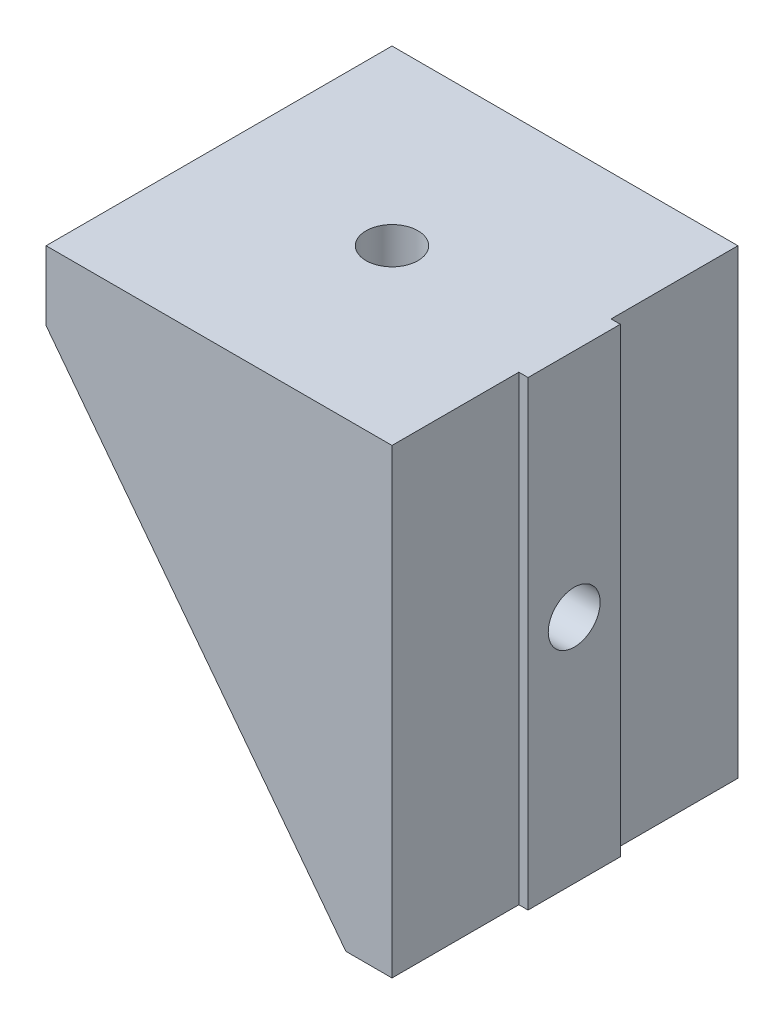
ISO-10303-21;
HEADER;
FILE_DESCRIPTION(('STEP AP214'),'2;1');
FILE_NAME('part.step','',(''),(''),'','','');
FILE_SCHEMA(('AUTOMOTIVE_DESIGN { 1 0 10303 214 1 1 1 1 }'));
ENDSEC;
DATA;
#1=APPLICATION_CONTEXT('core data for automotive mechanical design processes');
#2=APPLICATION_PROTOCOL_DEFINITION('international standard','automotive_design',2000,#1);
#3=PRODUCT_CONTEXT('',#1,'mechanical');
#4=PRODUCT('Part','Part','',(#3));
#5=PRODUCT_RELATED_PRODUCT_CATEGORY('part','',(#4));
#6=PRODUCT_DEFINITION_FORMATION('','',#4);
#7=PRODUCT_DEFINITION_CONTEXT('part definition',#1,'design');
#8=PRODUCT_DEFINITION('design','',#6,#7);
#9=PRODUCT_DEFINITION_SHAPE('','',#8);
#10=(LENGTH_UNIT() NAMED_UNIT(*) SI_UNIT(.MILLI.,.METRE.));
#11=(NAMED_UNIT(*) PLANE_ANGLE_UNIT() SI_UNIT($,.RADIAN.));
#12=(NAMED_UNIT(*) SI_UNIT($,.STERADIAN.) SOLID_ANGLE_UNIT());
#13=UNCERTAINTY_MEASURE_WITH_UNIT(LENGTH_MEASURE(1.E-05),#10,'distance_accuracy_value','');
#14=(GEOMETRIC_REPRESENTATION_CONTEXT(3) GLOBAL_UNCERTAINTY_ASSIGNED_CONTEXT((#13)) GLOBAL_UNIT_ASSIGNED_CONTEXT((#10,
#11,#12)) REPRESENTATION_CONTEXT('',''));
#15=CARTESIAN_POINT('',(0.,0.,0.));
#16=DIRECTION('',(0.,0.,1.));
#17=DIRECTION('',(1.,0.,0.));
#18=AXIS2_PLACEMENT_3D('',#15,#16,#17);
#19=CARTESIAN_POINT('',(-30.,-6.,15.));
#20=DIRECTION('',(0.794357832977196,0.607450107570797,0.));
#21=DIRECTION('',(-0.607450107570797,0.794357832977196,0.));
#22=AXIS2_PLACEMENT_3D('',#19,#20,#21);
#23=PLANE('',#22);
#24=DIRECTION('',(0.607450107570797,-0.794357832977196,0.));
#25=VECTOR('',#24,1.);
#26=CARTESIAN_POINT('',(-30.,-6.,-10.));
#27=LINE('',#26,#25);
#28=CARTESIAN_POINT('',(-30.,-6.,-10.));
#29=VERTEX_POINT('',#28);
#30=CARTESIAN_POINT('',(-4.,-40.,-10.));
#31=VERTEX_POINT('',#30);
#32=EDGE_CURVE('E11',#29,#31,#27,.T.);
#33=ORIENTED_EDGE('',*,*,#32,.F.);
#34=DIRECTION('',(0.,0.,-1.));
#35=VECTOR('',#34,1.);
#36=CARTESIAN_POINT('',(-30.,-6.,15.));
#37=LINE('',#36,#35);
#38=CARTESIAN_POINT('',(-30.,-6.,-15.));
#39=VERTEX_POINT('',#38);
#40=EDGE_CURVE('E208',#29,#39,#37,.T.);
#41=ORIENTED_EDGE('',*,*,#40,.T.);
#42=DIRECTION('',(0.607450107570797,-0.794357832977196,0.));
#43=VECTOR('',#42,1.);
#44=CARTESIAN_POINT('',(-30.,-6.,-15.));
#45=LINE('',#44,#43);
#46=CARTESIAN_POINT('',(-4.,-40.,-15.));
#47=VERTEX_POINT('',#46);
#48=EDGE_CURVE('E230',#39,#47,#45,.T.);
#49=ORIENTED_EDGE('',*,*,#48,.T.);
#50=DIRECTION('',(0.,0.,-1.));
#51=VECTOR('',#50,1.);
#52=CARTESIAN_POINT('',(-4.,-40.,15.));
#53=LINE('',#52,#51);
#54=EDGE_CURVE('E197',#31,#47,#53,.T.);
#55=ORIENTED_EDGE('',*,*,#54,.F.);
#56=EDGE_LOOP('',(#33,#41,#49,#55));
#57=FACE_BOUND('',#56,.T.);
#58=ADVANCED_FACE('F34',(#57),#23,.F.);
#59=CARTESIAN_POINT('',(0.,-40.,15.));
#60=DIRECTION('',(-1.,0.,0.));
#61=DIRECTION('',(0.,0.,1.));
#62=AXIS2_PLACEMENT_3D('',#59,#60,#61);
#63=PLANE('',#62);
#64=DIRECTION('',(0.,-1.,0.));
#65=VECTOR('',#64,1.);
#66=CARTESIAN_POINT('',(0.,0.,4.));
#67=LINE('',#66,#65);
#68=CARTESIAN_POINT('',(0.,0.,4.));
#69=VERTEX_POINT('',#68);
#70=CARTESIAN_POINT('',(0.,-40.,4.));
#71=VERTEX_POINT('',#70);
#72=EDGE_CURVE('E149',#69,#71,#67,.T.);
#73=ORIENTED_EDGE('',*,*,#72,.F.);
#74=DIRECTION('',(0.,0.,-1.));
#75=VECTOR('',#74,1.);
#76=CARTESIAN_POINT('',(0.,0.,15.));
#77=LINE('',#76,#75);
#78=CARTESIAN_POINT('',(0.,0.,15.));
#79=VERTEX_POINT('',#78);
#80=EDGE_CURVE('E177',#79,#69,#77,.T.);
#81=ORIENTED_EDGE('',*,*,#80,.F.);
#82=DIRECTION('',(0.,1.,0.));
#83=VECTOR('',#82,1.);
#84=CARTESIAN_POINT('',(0.,-40.,15.));
#85=LINE('',#84,#83);
#86=CARTESIAN_POINT('',(0.,-40.,15.));
#87=VERTEX_POINT('',#86);
#88=EDGE_CURVE('E243',#87,#79,#85,.T.);
#89=ORIENTED_EDGE('',*,*,#88,.F.);
#90=DIRECTION('',(0.,0.,-1.));
#91=VECTOR('',#90,1.);
#92=CARTESIAN_POINT('',(0.,-40.,15.));
#93=LINE('',#92,#91);
#94=EDGE_CURVE('E194',#87,#71,#93,.T.);
#95=ORIENTED_EDGE('',*,*,#94,.T.);
#96=EDGE_LOOP('',(#73,#81,#89,#95));
#97=FACE_BOUND('',#96,.T.);
#98=ADVANCED_FACE('F36',(#97),#63,.F.);
#99=DIRECTION('',(0.,1.,0.));
#100=VECTOR('',#99,1.);
#101=CARTESIAN_POINT('',(0.,0.,-4.));
#102=LINE('',#101,#100);
#103=CARTESIAN_POINT('',(0.,-40.,-4.));
#104=VERTEX_POINT('',#103);
#105=CARTESIAN_POINT('',(0.,0.,-4.));
#106=VERTEX_POINT('',#105);
#107=EDGE_CURVE('E57',#104,#106,#102,.T.);
#108=ORIENTED_EDGE('',*,*,#107,.F.);
#109=CARTESIAN_POINT('',(0.,-40.,-15.));
#110=VERTEX_POINT('',#109);
#111=EDGE_CURVE('E198',#104,#110,#93,.T.);
#112=ORIENTED_EDGE('',*,*,#111,.T.);
#113=DIRECTION('',(0.,1.,0.));
#114=VECTOR('',#113,1.);
#115=CARTESIAN_POINT('',(0.,-40.,-15.));
#116=LINE('',#115,#114);
#117=CARTESIAN_POINT('',(0.,0.,-15.));
#118=VERTEX_POINT('',#117);
#119=EDGE_CURVE('E232',#110,#118,#116,.T.);
#120=ORIENTED_EDGE('',*,*,#119,.T.);
#121=EDGE_CURVE('E183',#106,#118,#77,.T.);
#122=ORIENTED_EDGE('',*,*,#121,.F.);
#123=EDGE_LOOP('',(#108,#112,#120,#122));
#124=FACE_BOUND('',#123,.T.);
#125=ADVANCED_FACE('F253',(#124),#63,.F.);
#126=CARTESIAN_POINT('',(0.,0.,15.));
#127=DIRECTION('',(0.,-1.,0.));
#128=DIRECTION('',(0.,0.,-1.));
#129=AXIS2_PLACEMENT_3D('',#126,#127,#128);
#130=PLANE('',#129);
#131=CARTESIAN_POINT('',(-15.,0.,0.));
#132=DIRECTION('',(0.,1.,0.));
#133=DIRECTION('',(0.,0.,1.));
#134=AXIS2_PLACEMENT_3D('',#131,#132,#133);
#135=CIRCLE('',#134,2.25);
#136=CARTESIAN_POINT('',(-15.,0.,2.25));
#137=VERTEX_POINT('',#136);
#138=EDGE_CURVE('E390',#137,#137,#135,.T.);
#139=ORIENTED_EDGE('',*,*,#138,.F.);
#140=EDGE_LOOP('',(#139));
#141=FACE_BOUND('',#140,.T.);
#142=DIRECTION('',(-1.,0.,0.));
#143=VECTOR('',#142,1.);
#144=CARTESIAN_POINT('',(0.,0.,-15.));
#145=LINE('',#144,#143);
#146=CARTESIAN_POINT('',(-30.,0.,-15.));
#147=VERTEX_POINT('',#146);
#148=EDGE_CURVE('E226',#118,#147,#145,.T.);
#149=ORIENTED_EDGE('',*,*,#148,.T.);
#150=DIRECTION('',(0.,0.,-1.));
#151=VECTOR('',#150,1.);
#152=CARTESIAN_POINT('',(-30.,0.,15.));
#153=LINE('',#152,#151);
#154=CARTESIAN_POINT('',(-30.,0.,15.));
#155=VERTEX_POINT('',#154);
#156=EDGE_CURVE('E188',#155,#147,#153,.T.);
#157=ORIENTED_EDGE('',*,*,#156,.F.);
#158=DIRECTION('',(-1.,0.,0.));
#159=VECTOR('',#158,1.);
#160=CARTESIAN_POINT('',(0.,0.,15.));
#161=LINE('',#160,#159);
#162=EDGE_CURVE('E242',#79,#155,#161,.T.);
#163=ORIENTED_EDGE('',*,*,#162,.F.);
#164=ORIENTED_EDGE('',*,*,#80,.T.);
#165=DIRECTION('',(-1.,0.,0.));
#166=VECTOR('',#165,1.);
#167=CARTESIAN_POINT('',(0.8,0.,4.));
#168=LINE('',#167,#166);
#169=CARTESIAN_POINT('',(0.8,0.,4.));
#170=VERTEX_POINT('',#169);
#171=EDGE_CURVE('E160',#170,#69,#168,.T.);
#172=ORIENTED_EDGE('',*,*,#171,.F.);
#173=DIRECTION('',(0.,0.,1.));
#174=VECTOR('',#173,1.);
#175=CARTESIAN_POINT('',(0.8,0.,4.));
#176=LINE('',#175,#174);
#177=CARTESIAN_POINT('',(0.8,0.,-4.));
#178=VERTEX_POINT('',#177);
#179=EDGE_CURVE('E158',#178,#170,#176,.T.);
#180=ORIENTED_EDGE('',*,*,#179,.F.);
#181=DIRECTION('',(-1.,0.,0.));
#182=VECTOR('',#181,1.);
#183=CARTESIAN_POINT('',(0.8,0.,-4.));
#184=LINE('',#183,#182);
#185=EDGE_CURVE('E173',#178,#106,#184,.T.);
#186=ORIENTED_EDGE('',*,*,#185,.T.);
#187=ORIENTED_EDGE('',*,*,#121,.T.);
#188=EDGE_LOOP('',(#149,#157,#163,#164,#172,#180,#186,#187));
#189=FACE_BOUND('',#188,.T.);
#190=ADVANCED_FACE('F261',(#141,#189),#130,.F.);
#191=CARTESIAN_POINT('',(-30.,0.,15.));
#192=DIRECTION('',(1.,0.,0.));
#193=DIRECTION('',(0.,0.,-1.));
#194=AXIS2_PLACEMENT_3D('',#191,#192,#193);
#195=PLANE('',#194);
#196=DIRECTION('',(0.,-1.,0.));
#197=VECTOR('',#196,1.);
#198=CARTESIAN_POINT('',(-30.,0.,-15.));
#199=LINE('',#198,#197);
#200=EDGE_CURVE('E218',#147,#39,#199,.T.);
#201=ORIENTED_EDGE('',*,*,#200,.T.);
#202=ORIENTED_EDGE('',*,*,#40,.F.);
#203=DIRECTION('',(0.,0.,1.));
#204=VECTOR('',#203,1.);
#205=CARTESIAN_POINT('',(-30.,-6.,-10.));
#206=LINE('',#205,#204);
#207=CARTESIAN_POINT('',(-30.,-6.,10.));
#208=VERTEX_POINT('',#207);
#209=EDGE_CURVE('E129',#29,#208,#206,.T.);
#210=ORIENTED_EDGE('',*,*,#209,.T.);
#211=CARTESIAN_POINT('',(-30.,-6.,15.));
#212=VERTEX_POINT('',#211);
#213=EDGE_CURVE('E209',#212,#208,#37,.T.);
#214=ORIENTED_EDGE('',*,*,#213,.F.);
#215=DIRECTION('',(0.,-1.,0.));
#216=VECTOR('',#215,1.);
#217=CARTESIAN_POINT('',(-30.,0.,15.));
#218=LINE('',#217,#216);
#219=EDGE_CURVE('E221',#155,#212,#218,.T.);
#220=ORIENTED_EDGE('',*,*,#219,.F.);
#221=ORIENTED_EDGE('',*,*,#156,.T.);
#222=EDGE_LOOP('',(#201,#202,#210,#214,#220,#221));
#223=FACE_BOUND('',#222,.T.);
#224=ADVANCED_FACE('F216',(#223),#195,.F.);
#225=ORIENTED_EDGE('',*,*,#213,.T.);
#226=DIRECTION('',(0.607450107570797,-0.794357832977196,0.));
#227=VECTOR('',#226,1.);
#228=CARTESIAN_POINT('',(-30.,-6.,10.));
#229=LINE('',#228,#227);
#230=CARTESIAN_POINT('',(-4.,-40.,10.));
#231=VERTEX_POINT('',#230);
#232=EDGE_CURVE('E43',#208,#231,#229,.T.);
#233=ORIENTED_EDGE('',*,*,#232,.T.);
#234=CARTESIAN_POINT('',(-4.,-40.,15.));
#235=VERTEX_POINT('',#234);
#236=EDGE_CURVE('E205',#235,#231,#53,.T.);
#237=ORIENTED_EDGE('',*,*,#236,.F.);
#238=DIRECTION('',(0.607450107570797,-0.794357832977196,0.));
#239=VECTOR('',#238,1.);
#240=CARTESIAN_POINT('',(-30.,-6.,15.));
#241=LINE('',#240,#239);
#242=EDGE_CURVE('E239',#212,#235,#241,.T.);
#243=ORIENTED_EDGE('',*,*,#242,.F.);
#244=EDGE_LOOP('',(#225,#233,#237,#243));
#245=FACE_BOUND('',#244,.T.);
#246=ADVANCED_FACE('F283',(#245),#23,.F.);
#247=CARTESIAN_POINT('',(-4.,-40.,15.));
#248=DIRECTION('',(0.,1.,0.));
#249=DIRECTION('',(0.,0.,1.));
#250=AXIS2_PLACEMENT_3D('',#247,#248,#249);
#251=PLANE('',#250);
#252=DIRECTION('',(1.,0.,0.));
#253=VECTOR('',#252,1.);
#254=CARTESIAN_POINT('',(-4.,-40.,-15.));
#255=LINE('',#254,#253);
#256=EDGE_CURVE('E203',#47,#110,#255,.T.);
#257=ORIENTED_EDGE('',*,*,#256,.T.);
#258=ORIENTED_EDGE('',*,*,#111,.F.);
#259=DIRECTION('',(-1.,0.,0.));
#260=VECTOR('',#259,1.);
#261=CARTESIAN_POINT('',(0.8,-40.,-3.99999999999999));
#262=LINE('',#261,#260);
#263=CARTESIAN_POINT('',(0.8,-40.,-3.99999999999999));
#264=VERTEX_POINT('',#263);
#265=EDGE_CURVE('E260',#264,#104,#262,.T.);
#266=ORIENTED_EDGE('',*,*,#265,.F.);
#267=DIRECTION('',(0.,0.,-1.));
#268=VECTOR('',#267,1.);
#269=CARTESIAN_POINT('',(0.8,-40.,3.99999999999999));
#270=LINE('',#269,#268);
#271=CARTESIAN_POINT('',(0.8,-40.,3.99999999999999));
#272=VERTEX_POINT('',#271);
#273=EDGE_CURVE('E154',#272,#264,#270,.T.);
#274=ORIENTED_EDGE('',*,*,#273,.F.);
#275=DIRECTION('',(-1.,0.,0.));
#276=VECTOR('',#275,1.);
#277=CARTESIAN_POINT('',(0.8,-40.,3.99999999999999));
#278=LINE('',#277,#276);
#279=EDGE_CURVE('E236',#272,#71,#278,.T.);
#280=ORIENTED_EDGE('',*,*,#279,.T.);
#281=ORIENTED_EDGE('',*,*,#94,.F.);
#282=DIRECTION('',(1.,0.,0.));
#283=VECTOR('',#282,1.);
#284=CARTESIAN_POINT('',(-4.,-40.,15.));
#285=LINE('',#284,#283);
#286=EDGE_CURVE('E237',#235,#87,#285,.T.);
#287=ORIENTED_EDGE('',*,*,#286,.F.);
#288=ORIENTED_EDGE('',*,*,#236,.T.);
#289=DIRECTION('',(0.,0.,1.));
#290=VECTOR('',#289,1.);
#291=CARTESIAN_POINT('',(-4.,-40.,-10.));
#292=LINE('',#291,#290);
#293=EDGE_CURVE('E130',#31,#231,#292,.T.);
#294=ORIENTED_EDGE('',*,*,#293,.F.);
#295=ORIENTED_EDGE('',*,*,#54,.T.);
#296=EDGE_LOOP('',(#257,#258,#266,#274,#280,#281,#287,#288,#294,#295));
#297=FACE_BOUND('',#296,.T.);
#298=ADVANCED_FACE('F249',(#297),#251,.F.);
#299=CARTESIAN_POINT('',(0.,0.,15.));
#300=DIRECTION('',(0.,0.,1.));
#301=DIRECTION('',(1.,0.,0.));
#302=AXIS2_PLACEMENT_3D('',#299,#300,#301);
#303=PLANE('',#302);
#304=ORIENTED_EDGE('',*,*,#88,.T.);
#305=ORIENTED_EDGE('',*,*,#162,.T.);
#306=ORIENTED_EDGE('',*,*,#219,.T.);
#307=ORIENTED_EDGE('',*,*,#242,.T.);
#308=ORIENTED_EDGE('',*,*,#286,.T.);
#309=EDGE_LOOP('',(#304,#305,#306,#307,#308));
#310=FACE_BOUND('',#309,.T.);
#311=ADVANCED_FACE('F293',(#310),#303,.T.);
#312=CARTESIAN_POINT('',(0.,0.,-15.));
#313=DIRECTION('',(0.,0.,1.));
#314=DIRECTION('',(1.,0.,0.));
#315=AXIS2_PLACEMENT_3D('',#312,#313,#314);
#316=PLANE('',#315);
#317=ORIENTED_EDGE('',*,*,#119,.F.);
#318=ORIENTED_EDGE('',*,*,#256,.F.);
#319=ORIENTED_EDGE('',*,*,#48,.F.);
#320=ORIENTED_EDGE('',*,*,#200,.F.);
#321=ORIENTED_EDGE('',*,*,#148,.F.);
#322=EDGE_LOOP('',(#317,#318,#319,#320,#321));
#323=FACE_BOUND('',#322,.T.);
#324=ADVANCED_FACE('F225',(#323),#316,.F.);
#325=CARTESIAN_POINT('',(0.8,0.,4.));
#326=DIRECTION('',(0.,0.,-1.));
#327=DIRECTION('',(0.,1.,0.));
#328=AXIS2_PLACEMENT_3D('',#325,#326,#327);
#329=PLANE('',#328);
#330=ORIENTED_EDGE('',*,*,#72,.T.);
#331=ORIENTED_EDGE('',*,*,#279,.F.);
#332=DIRECTION('',(0.,-1.,0.));
#333=VECTOR('',#332,1.);
#334=CARTESIAN_POINT('',(0.8,0.,4.));
#335=LINE('',#334,#333);
#336=EDGE_CURVE('E151',#170,#272,#335,.T.);
#337=ORIENTED_EDGE('',*,*,#336,.F.);
#338=ORIENTED_EDGE('',*,*,#171,.T.);
#339=EDGE_LOOP('',(#330,#331,#337,#338));
#340=FACE_BOUND('',#339,.T.);
#341=ADVANCED_FACE('F274',(#340),#329,.F.);
#342=CARTESIAN_POINT('',(0.8,0.,-4.));
#343=DIRECTION('',(0.,0.,1.));
#344=DIRECTION('',(0.,-1.,0.));
#345=AXIS2_PLACEMENT_3D('',#342,#343,#344);
#346=PLANE('',#345);
#347=ORIENTED_EDGE('',*,*,#107,.T.);
#348=ORIENTED_EDGE('',*,*,#185,.F.);
#349=DIRECTION('',(0.,1.,0.));
#350=VECTOR('',#349,1.);
#351=CARTESIAN_POINT('',(0.8,0.,-4.));
#352=LINE('',#351,#350);
#353=EDGE_CURVE('E156',#264,#178,#352,.T.);
#354=ORIENTED_EDGE('',*,*,#353,.F.);
#355=ORIENTED_EDGE('',*,*,#265,.T.);
#356=EDGE_LOOP('',(#347,#348,#354,#355));
#357=FACE_BOUND('',#356,.T.);
#358=ADVANCED_FACE('F257',(#357),#346,.F.);
#359=CARTESIAN_POINT('',(0.8,0.,0.));
#360=DIRECTION('',(1.,0.,0.));
#361=DIRECTION('',(0.,0.,-1.));
#362=AXIS2_PLACEMENT_3D('',#359,#360,#361);
#363=PLANE('',#362);
#364=CARTESIAN_POINT('',(0.8,-20.,0.));
#365=DIRECTION('',(1.,0.,0.));
#366=DIRECTION('',(0.,0.,-1.));
#367=AXIS2_PLACEMENT_3D('',#364,#365,#366);
#368=CIRCLE('',#367,2.25);
#369=CARTESIAN_POINT('',(0.8,-20.,2.25));
#370=VERTEX_POINT('',#369);
#371=EDGE_CURVE('E147',#370,#370,#368,.T.);
#372=ORIENTED_EDGE('',*,*,#371,.F.);
#373=EDGE_LOOP('',(#372));
#374=FACE_BOUND('',#373,.T.);
#375=ORIENTED_EDGE('',*,*,#336,.T.);
#376=ORIENTED_EDGE('',*,*,#273,.T.);
#377=ORIENTED_EDGE('',*,*,#353,.T.);
#378=ORIENTED_EDGE('',*,*,#179,.T.);
#379=EDGE_LOOP('',(#375,#376,#377,#378));
#380=FACE_BOUND('',#379,.T.);
#381=ADVANCED_FACE('F305',(#374,#380),#363,.T.);
#382=CARTESIAN_POINT('',(0.,0.,-10.));
#383=DIRECTION('',(0.,0.,1.));
#384=DIRECTION('',(1.,0.,0.));
#385=AXIS2_PLACEMENT_3D('',#382,#383,#384);
#386=PLANE('',#385);
#387=ORIENTED_EDGE('',*,*,#32,.T.);
#388=DIRECTION('',(0.,1.,0.));
#389=VECTOR('',#388,1.);
#390=CARTESIAN_POINT('',(-4.00000000000001,-6.,-10.));
#391=LINE('',#390,#389);
#392=CARTESIAN_POINT('',(-4.00000000000001,-6.,-10.));
#393=VERTEX_POINT('',#392);
#394=EDGE_CURVE('E50',#31,#393,#391,.T.);
#395=ORIENTED_EDGE('',*,*,#394,.T.);
#396=DIRECTION('',(-1.,0.,0.));
#397=VECTOR('',#396,1.);
#398=CARTESIAN_POINT('',(-30.,-6.,-10.));
#399=LINE('',#398,#397);
#400=EDGE_CURVE('E135',#393,#29,#399,.T.);
#401=ORIENTED_EDGE('',*,*,#400,.T.);
#402=EDGE_LOOP('',(#387,#395,#401));
#403=FACE_BOUND('',#402,.T.);
#404=ADVANCED_FACE('F134',(#403),#386,.T.);
#405=CARTESIAN_POINT('',(0.,0.,10.));
#406=DIRECTION('',(0.,0.,1.));
#407=DIRECTION('',(1.,0.,0.));
#408=AXIS2_PLACEMENT_3D('',#405,#406,#407);
#409=PLANE('',#408);
#410=DIRECTION('',(-1.,0.,0.));
#411=VECTOR('',#410,1.);
#412=CARTESIAN_POINT('',(-30.,-6.,10.));
#413=LINE('',#412,#411);
#414=CARTESIAN_POINT('',(-4.00000000000001,-6.,10.));
#415=VERTEX_POINT('',#414);
#416=EDGE_CURVE('E138',#415,#208,#413,.T.);
#417=ORIENTED_EDGE('',*,*,#416,.F.);
#418=DIRECTION('',(0.,1.,0.));
#419=VECTOR('',#418,1.);
#420=CARTESIAN_POINT('',(-4.00000000000001,-6.,10.));
#421=LINE('',#420,#419);
#422=EDGE_CURVE('E124',#231,#415,#421,.T.);
#423=ORIENTED_EDGE('',*,*,#422,.F.);
#424=ORIENTED_EDGE('',*,*,#232,.F.);
#425=EDGE_LOOP('',(#417,#423,#424));
#426=FACE_BOUND('',#425,.T.);
#427=ADVANCED_FACE('F296',(#426),#409,.F.);
#428=CARTESIAN_POINT('',(-30.,-6.,-10.));
#429=DIRECTION('',(0.,1.,0.));
#430=DIRECTION('',(0.,0.,1.));
#431=AXIS2_PLACEMENT_3D('',#428,#429,#430);
#432=PLANE('',#431);
#433=CARTESIAN_POINT('',(-15.,-6.00000000000001,0.));
#434=DIRECTION('',(0.,1.,0.));
#435=DIRECTION('',(0.,0.,1.));
#436=AXIS2_PLACEMENT_3D('',#433,#434,#435);
#437=CIRCLE('',#436,2.25);
#438=CARTESIAN_POINT('',(-15.,-6.00000000000001,2.25));
#439=VERTEX_POINT('',#438);
#440=EDGE_CURVE('E38',#439,#439,#437,.T.);
#441=ORIENTED_EDGE('',*,*,#440,.T.);
#442=EDGE_LOOP('',(#441));
#443=FACE_BOUND('',#442,.T.);
#444=ORIENTED_EDGE('',*,*,#416,.T.);
#445=ORIENTED_EDGE('',*,*,#209,.F.);
#446=ORIENTED_EDGE('',*,*,#400,.F.);
#447=DIRECTION('',(0.,0.,1.));
#448=VECTOR('',#447,1.);
#449=CARTESIAN_POINT('',(-4.00000000000001,-6.,-10.));
#450=LINE('',#449,#448);
#451=EDGE_CURVE('E121',#393,#415,#450,.T.);
#452=ORIENTED_EDGE('',*,*,#451,.T.);
#453=EDGE_LOOP('',(#444,#445,#446,#452));
#454=FACE_BOUND('',#453,.T.);
#455=ADVANCED_FACE('F140',(#443,#454),#432,.F.);
#456=CARTESIAN_POINT('',(-4.00000000000001,-6.,-10.));
#457=DIRECTION('',(1.,0.,0.));
#458=DIRECTION('',(0.,1.,0.));
#459=AXIS2_PLACEMENT_3D('',#456,#457,#458);
#460=PLANE('',#459);
#461=CARTESIAN_POINT('',(-4.00000000000001,-20.,0.));
#462=DIRECTION('',(-1.,0.,0.));
#463=DIRECTION('',(0.,0.,1.));
#464=AXIS2_PLACEMENT_3D('',#461,#462,#463);
#465=CIRCLE('',#464,2.25);
#466=CARTESIAN_POINT('',(-4.00000000000001,-20.,2.25));
#467=VERTEX_POINT('',#466);
#468=EDGE_CURVE('E393',#467,#467,#465,.T.);
#469=ORIENTED_EDGE('',*,*,#468,.F.);
#470=EDGE_LOOP('',(#469));
#471=FACE_BOUND('',#470,.T.);
#472=ORIENTED_EDGE('',*,*,#422,.T.);
#473=ORIENTED_EDGE('',*,*,#451,.F.);
#474=ORIENTED_EDGE('',*,*,#394,.F.);
#475=ORIENTED_EDGE('',*,*,#293,.T.);
#476=EDGE_LOOP('',(#472,#473,#474,#475));
#477=FACE_BOUND('',#476,.T.);
#478=ADVANCED_FACE('F122',(#471,#477),#460,.F.);
#479=CARTESIAN_POINT('',(0.800025,-20.,0.));
#480=DIRECTION('',(-1.,0.,0.));
#481=DIRECTION('',(0.,0.,1.));
#482=AXIS2_PLACEMENT_3D('',#479,#480,#481);
#483=CYLINDRICAL_SURFACE('',#482,2.25);
#484=CARTESIAN_POINT('',(0.8,-20.,2.25));
#485=CARTESIAN_POINT('',(0.75,-20.,2.25));
#486=CARTESIAN_POINT('',(0.7,-20.,2.25));
#487=CARTESIAN_POINT('',(0.6,-20.,2.25));
#488=CARTESIAN_POINT('',(0.55,-20.,2.25));
#489=CARTESIAN_POINT('',(0.45,-20.,2.25));
#490=CARTESIAN_POINT('',(0.399999999999999,-20.,2.25));
#491=CARTESIAN_POINT('',(0.299999999999999,-20.,2.25));
#492=CARTESIAN_POINT('',(0.249999999999999,-20.,2.25));
#493=CARTESIAN_POINT('',(0.149999999999999,-20.,2.25));
#494=CARTESIAN_POINT('',(0.0999999999999992,-20.,2.25));
#495=CARTESIAN_POINT('',(0.,-20.,2.25));
#496=CARTESIAN_POINT('',(-0.0500000000000011,-20.,2.25));
#497=CARTESIAN_POINT('',(-0.150000000000001,-20.,2.25));
#498=CARTESIAN_POINT('',(-0.200000000000001,-20.,2.25));
#499=CARTESIAN_POINT('',(-0.300000000000001,-20.,2.25));
#500=CARTESIAN_POINT('',(-0.350000000000001,-20.,2.25));
#501=CARTESIAN_POINT('',(-0.450000000000002,-20.,2.25));
#502=CARTESIAN_POINT('',(-0.500000000000002,-20.,2.25));
#503=CARTESIAN_POINT('',(-0.600000000000002,-20.,2.25));
#504=CARTESIAN_POINT('',(-0.650000000000002,-20.,2.25));
#505=CARTESIAN_POINT('',(-0.750000000000002,-20.,2.25));
#506=CARTESIAN_POINT('',(-0.800000000000002,-20.,2.25));
#507=CARTESIAN_POINT('',(-0.900000000000002,-20.,2.25));
#508=CARTESIAN_POINT('',(-0.950000000000002,-20.,2.25));
#509=CARTESIAN_POINT('',(-1.05,-20.,2.25));
#510=CARTESIAN_POINT('',(-1.1,-20.,2.25));
#511=CARTESIAN_POINT('',(-1.2,-20.,2.25));
#512=CARTESIAN_POINT('',(-1.25,-20.,2.25));
#513=CARTESIAN_POINT('',(-1.35,-20.,2.25));
#514=CARTESIAN_POINT('',(-1.4,-20.,2.25));
#515=CARTESIAN_POINT('',(-1.5,-20.,2.25));
#516=CARTESIAN_POINT('',(-1.55,-20.,2.25));
#517=CARTESIAN_POINT('',(-1.65,-20.,2.25));
#518=CARTESIAN_POINT('',(-1.7,-20.,2.25));
#519=CARTESIAN_POINT('',(-1.8,-20.,2.25));
#520=CARTESIAN_POINT('',(-1.85,-20.,2.25));
#521=CARTESIAN_POINT('',(-1.95,-20.,2.25));
#522=CARTESIAN_POINT('',(-2.,-20.,2.25));
#523=CARTESIAN_POINT('',(-2.1,-20.,2.25));
#524=CARTESIAN_POINT('',(-2.15,-20.,2.25));
#525=CARTESIAN_POINT('',(-2.25,-20.,2.25));
#526=CARTESIAN_POINT('',(-2.3,-20.,2.25));
#527=CARTESIAN_POINT('',(-2.4,-20.,2.25));
#528=CARTESIAN_POINT('',(-2.45,-20.,2.25));
#529=CARTESIAN_POINT('',(-2.55,-20.,2.25));
#530=CARTESIAN_POINT('',(-2.6,-20.,2.25));
#531=CARTESIAN_POINT('',(-2.7,-20.,2.25));
#532=CARTESIAN_POINT('',(-2.75,-20.,2.25));
#533=CARTESIAN_POINT('',(-2.85,-20.,2.25));
#534=CARTESIAN_POINT('',(-2.9,-20.,2.25));
#535=CARTESIAN_POINT('',(-3.,-20.,2.25));
#536=CARTESIAN_POINT('',(-3.05000000000001,-20.,2.25));
#537=CARTESIAN_POINT('',(-3.15,-20.,2.25));
#538=CARTESIAN_POINT('',(-3.20000000000001,-20.,2.25));
#539=CARTESIAN_POINT('',(-3.3,-20.,2.25));
#540=CARTESIAN_POINT('',(-3.35,-20.,2.25));
#541=CARTESIAN_POINT('',(-3.45,-20.,2.25));
#542=CARTESIAN_POINT('',(-3.5,-20.,2.25));
#543=CARTESIAN_POINT('',(-3.6,-20.,2.25));
#544=CARTESIAN_POINT('',(-3.65,-20.,2.25));
#545=CARTESIAN_POINT('',(-3.75,-20.,2.25));
#546=CARTESIAN_POINT('',(-3.80000000000001,-20.,2.25));
#547=CARTESIAN_POINT('',(-3.90000000000001,-20.,2.25));
#548=CARTESIAN_POINT('',(-3.95000000000001,-20.,2.25));
#549=CARTESIAN_POINT('',(-4.00000000000001,-20.,2.25));
#550=B_SPLINE_CURVE_WITH_KNOTS('',3,(#484,#485,#486,#487,#488,#489,#490,#491,#492,#493,#494,
#495,#496,#497,#498,#499,#500,#501,#502,#503,#504,#505,#506,#507,#508,#509,#510,#511,#512,#513,
#514,#515,#516,#517,#518,#519,#520,#521,#522,#523,#524,#525,#526,#527,#528,#529,#530,#531,#532,
#533,#534,#535,#536,#537,#538,#539,#540,#541,#542,#543,#544,#545,#546,#547,#548,#549),
.UNSPECIFIED.,.F.,.F.,(4,2,2,2,2,2,2,2,2,2,2,2,2,2,2,2,2,2,2,2,2,2,2,2,2,2,2,2,2,2,2,2,4),(0.,
0.15,0.3,0.450000000000001,0.600000000000001,0.750000000000001,0.900000000000001,1.05,1.2,1.35,
1.5,1.65,1.8,1.95,2.1,2.25,2.4,2.55,2.7,2.85,3.,3.15,3.3,3.45,3.6,3.75,3.90000000000001,
4.05000000000001,4.2,4.35,4.5,4.65000000000001,4.80000000000001),.UNSPECIFIED.);
#551=EDGE_CURVE('BSEAM311',#370,#467,#550,.T.);
#552=ORIENTED_EDGE('',*,*,#371,.T.);
#553=ORIENTED_EDGE('',*,*,#468,.T.);
#554=ORIENTED_EDGE('',*,*,#551,.T.);
#555=ORIENTED_EDGE('',*,*,#551,.F.);
#556=EDGE_LOOP('',(#552,#554,#553,#555));
#557=FACE_BOUND('',#556,.T.);
#558=ADVANCED_FACE('F311',(#557),#483,.F.);
#559=CARTESIAN_POINT('',(-15.,-40.00005,0.));
#560=DIRECTION('',(0.,1.,0.));
#561=DIRECTION('',(0.,0.,1.));
#562=AXIS2_PLACEMENT_3D('',#559,#560,#561);
#563=CYLINDRICAL_SURFACE('',#562,2.25);
#564=CARTESIAN_POINT('',(-15.,0.,2.25));
#565=CARTESIAN_POINT('',(-15.,-0.0625000000000001,2.25));
#566=CARTESIAN_POINT('',(-15.,-0.125,2.25));
#567=CARTESIAN_POINT('',(-15.,-0.25,2.25));
#568=CARTESIAN_POINT('',(-15.,-0.3125,2.25));
#569=CARTESIAN_POINT('',(-15.,-0.4375,2.25));
#570=CARTESIAN_POINT('',(-15.,-0.5,2.25));
#571=CARTESIAN_POINT('',(-15.,-0.625000000000001,2.25));
#572=CARTESIAN_POINT('',(-15.,-0.687500000000001,2.25));
#573=CARTESIAN_POINT('',(-15.,-0.812500000000001,2.25));
#574=CARTESIAN_POINT('',(-15.,-0.875000000000001,2.25));
#575=CARTESIAN_POINT('',(-15.,-1.,2.25));
#576=CARTESIAN_POINT('',(-15.,-1.0625,2.25));
#577=CARTESIAN_POINT('',(-15.,-1.1875,2.25));
#578=CARTESIAN_POINT('',(-15.,-1.25,2.25));
#579=CARTESIAN_POINT('',(-15.,-1.375,2.25));
#580=CARTESIAN_POINT('',(-15.,-1.4375,2.25));
#581=CARTESIAN_POINT('',(-15.,-1.5625,2.25));
#582=CARTESIAN_POINT('',(-15.,-1.625,2.25));
#583=CARTESIAN_POINT('',(-15.,-1.75,2.25));
#584=CARTESIAN_POINT('',(-15.,-1.8125,2.25));
#585=CARTESIAN_POINT('',(-15.,-1.9375,2.25));
#586=CARTESIAN_POINT('',(-15.,-2.,2.25));
#587=CARTESIAN_POINT('',(-15.,-2.125,2.25));
#588=CARTESIAN_POINT('',(-15.,-2.1875,2.25));
#589=CARTESIAN_POINT('',(-15.,-2.3125,2.25));
#590=CARTESIAN_POINT('',(-15.,-2.375,2.25));
#591=CARTESIAN_POINT('',(-15.,-2.5,2.25));
#592=CARTESIAN_POINT('',(-15.,-2.5625,2.25));
#593=CARTESIAN_POINT('',(-15.,-2.6875,2.25));
#594=CARTESIAN_POINT('',(-15.,-2.75,2.25));
#595=CARTESIAN_POINT('',(-15.,-2.875,2.25));
#596=CARTESIAN_POINT('',(-15.,-2.9375,2.25));
#597=CARTESIAN_POINT('',(-15.,-3.0625,2.25));
#598=CARTESIAN_POINT('',(-15.,-3.125,2.25));
#599=CARTESIAN_POINT('',(-15.,-3.25,2.25));
#600=CARTESIAN_POINT('',(-15.,-3.3125,2.25));
#601=CARTESIAN_POINT('',(-15.,-3.4375,2.25));
#602=CARTESIAN_POINT('',(-15.,-3.5,2.25));
#603=CARTESIAN_POINT('',(-15.,-3.625,2.25));
#604=CARTESIAN_POINT('',(-15.,-3.6875,2.25));
#605=CARTESIAN_POINT('',(-15.,-3.8125,2.25));
#606=CARTESIAN_POINT('',(-15.,-3.875,2.25));
#607=CARTESIAN_POINT('',(-15.,-4.,2.25));
#608=CARTESIAN_POINT('',(-15.,-4.0625,2.25));
#609=CARTESIAN_POINT('',(-15.,-4.1875,2.25));
#610=CARTESIAN_POINT('',(-15.,-4.25,2.25));
#611=CARTESIAN_POINT('',(-15.,-4.375,2.25));
#612=CARTESIAN_POINT('',(-15.,-4.4375,2.25));
#613=CARTESIAN_POINT('',(-15.,-4.5625,2.25));
#614=CARTESIAN_POINT('',(-15.,-4.625,2.25));
#615=CARTESIAN_POINT('',(-15.,-4.75,2.25));
#616=CARTESIAN_POINT('',(-15.,-4.8125,2.25));
#617=CARTESIAN_POINT('',(-15.,-4.9375,2.25));
#618=CARTESIAN_POINT('',(-15.,-5.,2.25));
#619=CARTESIAN_POINT('',(-15.,-5.125,2.25));
#620=CARTESIAN_POINT('',(-15.,-5.1875,2.25));
#621=CARTESIAN_POINT('',(-15.,-5.3125,2.25));
#622=CARTESIAN_POINT('',(-15.,-5.375,2.25));
#623=CARTESIAN_POINT('',(-15.,-5.50000000000001,2.25));
#624=CARTESIAN_POINT('',(-15.,-5.56250000000001,2.25));
#625=CARTESIAN_POINT('',(-15.,-5.68750000000001,2.25));
#626=CARTESIAN_POINT('',(-15.,-5.75000000000001,2.25));
#627=CARTESIAN_POINT('',(-15.,-5.87500000000001,2.25));
#628=CARTESIAN_POINT('',(-15.,-5.93750000000001,2.25));
#629=CARTESIAN_POINT('',(-15.,-6.00000000000001,2.25));
#630=B_SPLINE_CURVE_WITH_KNOTS('',3,(#564,#565,#566,#567,#568,#569,#570,#571,#572,#573,#574,
#575,#576,#577,#578,#579,#580,#581,#582,#583,#584,#585,#586,#587,#588,#589,#590,#591,#592,#593,
#594,#595,#596,#597,#598,#599,#600,#601,#602,#603,#604,#605,#606,#607,#608,#609,#610,#611,#612,
#613,#614,#615,#616,#617,#618,#619,#620,#621,#622,#623,#624,#625,#626,#627,#628,#629),
.UNSPECIFIED.,.F.,.F.,(4,2,2,2,2,2,2,2,2,2,2,2,2,2,2,2,2,2,2,2,2,2,2,2,2,2,2,2,2,2,2,2,4),(0.,
0.1875,0.375,0.5625,0.750000000000001,0.937500000000001,1.125,1.3125,1.5,1.6875,1.875,2.0625,
2.25,2.4375,2.625,2.8125,3.,3.1875,3.375,3.5625,3.75,3.9375,4.125,4.3125,4.5,4.6875,4.875,
5.0625,5.25,5.4375,5.62500000000001,5.81250000000001,6.00000000000001),.UNSPECIFIED.);
#631=EDGE_CURVE('BSEAM374',#137,#439,#630,.T.);
#632=ORIENTED_EDGE('',*,*,#138,.T.);
#633=ORIENTED_EDGE('',*,*,#440,.F.);
#634=ORIENTED_EDGE('',*,*,#631,.T.);
#635=ORIENTED_EDGE('',*,*,#631,.F.);
#636=EDGE_LOOP('',(#632,#634,#633,#635));
#637=FACE_BOUND('',#636,.T.);
#638=ADVANCED_FACE('F374',(#637),#563,.F.);
#639=CLOSED_SHELL('',(#58,#98,#125,#190,#224,#246,#298,#311,#324,#341,#358,#381,#404,#427,#455,
#478,#558,#638));
#640=MANIFOLD_SOLID_BREP('B2',#639);
#641=ADVANCED_BREP_SHAPE_REPRESENTATION('',(#18,#640),#14);
#642=SHAPE_DEFINITION_REPRESENTATION(#9,#641);
ENDSEC;
END-ISO-10303-21;
